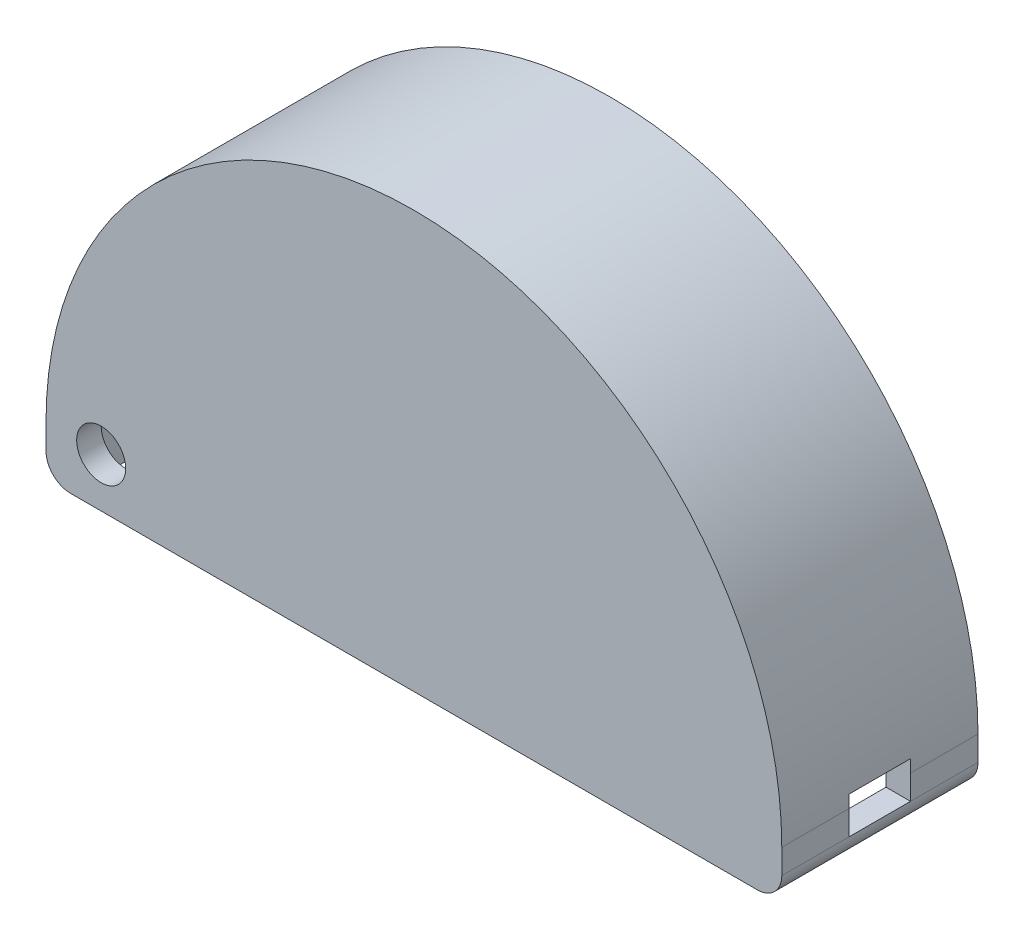
ISO-10303-21;
HEADER;
FILE_DESCRIPTION(('STEP AP214'),'2;1');
FILE_NAME('part.step','',(''),(''),'','','');
FILE_SCHEMA(('AUTOMOTIVE_DESIGN { 1 0 10303 214 1 1 1 1 }'));
ENDSEC;
DATA;
#1=APPLICATION_CONTEXT('core data for automotive mechanical design processes');
#2=APPLICATION_PROTOCOL_DEFINITION('international standard','automotive_design',2000,#1);
#3=PRODUCT_CONTEXT('',#1,'mechanical');
#4=PRODUCT('Part','Part','',(#3));
#5=PRODUCT_RELATED_PRODUCT_CATEGORY('part','',(#4));
#6=PRODUCT_DEFINITION_FORMATION('','',#4);
#7=PRODUCT_DEFINITION_CONTEXT('part definition',#1,'design');
#8=PRODUCT_DEFINITION('design','',#6,#7);
#9=PRODUCT_DEFINITION_SHAPE('','',#8);
#10=(LENGTH_UNIT() NAMED_UNIT(*) SI_UNIT(.MILLI.,.METRE.));
#11=(NAMED_UNIT(*) PLANE_ANGLE_UNIT() SI_UNIT($,.RADIAN.));
#12=(NAMED_UNIT(*) SI_UNIT($,.STERADIAN.) SOLID_ANGLE_UNIT());
#13=UNCERTAINTY_MEASURE_WITH_UNIT(LENGTH_MEASURE(1.E-05),#10,'distance_accuracy_value','');
#14=(GEOMETRIC_REPRESENTATION_CONTEXT(3) GLOBAL_UNCERTAINTY_ASSIGNED_CONTEXT((#13)) GLOBAL_UNIT_ASSIGNED_CONTEXT((#10,
#11,#12)) REPRESENTATION_CONTEXT('',''));
#15=CARTESIAN_POINT('',(0.,0.,0.));
#16=DIRECTION('',(0.,0.,1.));
#17=DIRECTION('',(1.,0.,0.));
#18=AXIS2_PLACEMENT_3D('',#15,#16,#17);
#19=CARTESIAN_POINT('',(27.75,-2.,-4.));
#20=DIRECTION('',(1.,0.,0.));
#21=DIRECTION('',(0.,1.,0.));
#22=AXIS2_PLACEMENT_3D('',#19,#20,#21);
#23=PLANE('',#22);
#24=DIRECTION('',(0.,1.,0.));
#25=VECTOR('',#24,1.);
#26=CARTESIAN_POINT('',(27.75,-2.,4.));
#27=LINE('',#26,#25);
#28=CARTESIAN_POINT('',(27.75,-0.999999999999998,4.));
#29=VERTEX_POINT('',#28);
#30=CARTESIAN_POINT('',(27.75,0.,4.));
#31=VERTEX_POINT('',#30);
#32=EDGE_CURVE('E242',#29,#31,#27,.T.);
#33=ORIENTED_EDGE('',*,*,#32,.F.);
#34=DIRECTION('',(0.,0.,1.));
#35=VECTOR('',#34,1.);
#36=CARTESIAN_POINT('',(27.75,-0.999999999999998,-4.));
#37=LINE('',#36,#35);
#38=CARTESIAN_POINT('',(27.75,-1.,1.25));
#39=VERTEX_POINT('',#38);
#40=EDGE_CURVE('E283',#29,#39,#37,.F.);
#41=ORIENTED_EDGE('',*,*,#40,.T.);
#42=DIRECTION('',(0.,-1.,0.));
#43=VECTOR('',#42,1.);
#44=CARTESIAN_POINT('',(27.75,-1.,1.25));
#45=LINE('',#44,#43);
#46=CARTESIAN_POINT('',(27.75,0.,1.25));
#47=VERTEX_POINT('',#46);
#48=EDGE_CURVE('E174',#47,#39,#45,.T.);
#49=ORIENTED_EDGE('',*,*,#48,.F.);
#50=DIRECTION('',(0.,0.,1.));
#51=VECTOR('',#50,1.);
#52=CARTESIAN_POINT('',(27.75,0.,-4.));
#53=LINE('',#52,#51);
#54=EDGE_CURVE('E258',#47,#31,#53,.T.);
#55=ORIENTED_EDGE('',*,*,#54,.T.);
#56=EDGE_LOOP('',(#33,#41,#49,#55));
#57=FACE_BOUND('',#56,.T.);
#58=ADVANCED_FACE('F39',(#57),#23,.T.);
#59=CARTESIAN_POINT('',(-2.25,-2.,-4.));
#60=DIRECTION('',(0.,-1.,0.));
#61=DIRECTION('',(0.,0.,-1.));
#62=AXIS2_PLACEMENT_3D('',#59,#60,#61);
#63=PLANE('',#62);
#64=DIRECTION('',(1.,0.,0.));
#65=VECTOR('',#64,1.);
#66=CARTESIAN_POINT('',(-2.25,-2.,-4.));
#67=LINE('',#66,#65);
#68=CARTESIAN_POINT('',(-1.25,-2.,-4.));
#69=VERTEX_POINT('',#68);
#70=CARTESIAN_POINT('',(26.75,-2.,-4.));
#71=VERTEX_POINT('',#70);
#72=EDGE_CURVE('E249',#69,#71,#67,.T.);
#73=ORIENTED_EDGE('',*,*,#72,.T.);
#74=DIRECTION('',(0.,0.,1.));
#75=VECTOR('',#74,1.);
#76=CARTESIAN_POINT('',(26.75,-2.,-4.));
#77=LINE('',#76,#75);
#78=CARTESIAN_POINT('',(26.75,-2.,-3.));
#79=VERTEX_POINT('',#78);
#80=EDGE_CURVE('E275',#71,#79,#77,.T.);
#81=ORIENTED_EDGE('',*,*,#80,.T.);
#82=DIRECTION('',(1.,0.,0.));
#83=VECTOR('',#82,1.);
#84=CARTESIAN_POINT('',(-2.25,-2.,-3.));
#85=LINE('',#84,#83);
#86=CARTESIAN_POINT('',(-1.25,-2.,-3.));
#87=VERTEX_POINT('',#86);
#88=EDGE_CURVE('E222',#87,#79,#85,.T.);
#89=ORIENTED_EDGE('',*,*,#88,.F.);
#90=DIRECTION('',(0.,0.,1.));
#91=VECTOR('',#90,1.);
#92=CARTESIAN_POINT('',(-1.25,-2.,-4.));
#93=LINE('',#92,#91);
#94=EDGE_CURVE('E269',#87,#69,#93,.F.);
#95=ORIENTED_EDGE('',*,*,#94,.T.);
#96=EDGE_LOOP('',(#73,#81,#89,#95));
#97=FACE_BOUND('',#96,.T.);
#98=ADVANCED_FACE('F291',(#97),#63,.T.);
#99=CARTESIAN_POINT('',(12.75,0.,-4.));
#100=DIRECTION('',(0.,0.,1.));
#101=DIRECTION('',(1.,0.,0.));
#102=AXIS2_PLACEMENT_3D('',#99,#100,#101);
#103=CYLINDRICAL_SURFACE('',#102,15.);
#104=CARTESIAN_POINT('',(12.75,0.,-1.25));
#105=DIRECTION('',(0.,0.,-1.));
#106=DIRECTION('',(-1.,0.,0.));
#107=AXIS2_PLACEMENT_3D('',#104,#105,#106);
#108=CIRCLE('',#107,15.);
#109=CARTESIAN_POINT('',(27.75,0.,-1.25));
#110=VERTEX_POINT('',#109);
#111=CARTESIAN_POINT('',(27.7416643505649,0.5,-1.25));
#112=VERTEX_POINT('',#111);
#113=EDGE_CURVE('E187',#110,#112,#108,.F.);
#114=ORIENTED_EDGE('',*,*,#113,.F.);
#115=CARTESIAN_POINT('',(27.75,0.,-4.));
#116=VERTEX_POINT('',#115);
#117=EDGE_CURVE('E255',#116,#110,#53,.T.);
#118=ORIENTED_EDGE('',*,*,#117,.F.);
#119=CARTESIAN_POINT('',(12.75,0.,-4.));
#120=DIRECTION('',(0.,0.,1.));
#121=DIRECTION('',(-1.,0.,0.));
#122=AXIS2_PLACEMENT_3D('',#119,#120,#121);
#123=CIRCLE('',#122,15.);
#124=CARTESIAN_POINT('',(-2.25,0.,-4.));
#125=VERTEX_POINT('',#124);
#126=EDGE_CURVE('E244',#116,#125,#123,.T.);
#127=ORIENTED_EDGE('',*,*,#126,.T.);
#128=DIRECTION('',(0.,0.,1.));
#129=VECTOR('',#128,1.);
#130=CARTESIAN_POINT('',(-2.25,0.,-4.));
#131=LINE('',#130,#129);
#132=CARTESIAN_POINT('',(-2.25,0.,4.));
#133=VERTEX_POINT('',#132);
#134=EDGE_CURVE('E254',#125,#133,#131,.T.);
#135=ORIENTED_EDGE('',*,*,#134,.T.);
#136=CARTESIAN_POINT('',(12.75,0.,4.));
#137=DIRECTION('',(0.,0.,1.));
#138=DIRECTION('',(-1.,0.,0.));
#139=AXIS2_PLACEMENT_3D('',#136,#137,#138);
#140=CIRCLE('',#139,15.);
#141=EDGE_CURVE('E210',#31,#133,#140,.T.);
#142=ORIENTED_EDGE('',*,*,#141,.F.);
#143=ORIENTED_EDGE('',*,*,#54,.F.);
#144=CARTESIAN_POINT('',(12.75,0.,1.25));
#145=DIRECTION('',(0.,0.,1.));
#146=DIRECTION('',(1.,0.,0.));
#147=AXIS2_PLACEMENT_3D('',#144,#145,#146);
#148=CIRCLE('',#147,15.);
#149=CARTESIAN_POINT('',(27.7416643505649,0.5,1.25));
#150=VERTEX_POINT('',#149);
#151=EDGE_CURVE('E182',#150,#47,#148,.F.);
#152=ORIENTED_EDGE('',*,*,#151,.F.);
#153=DIRECTION('',(0.,0.,1.));
#154=VECTOR('',#153,1.);
#155=CARTESIAN_POINT('',(27.7416643505649,0.5,-4.));
#156=LINE('',#155,#154);
#157=EDGE_CURVE('E173',#112,#150,#156,.T.);
#158=ORIENTED_EDGE('',*,*,#157,.F.);
#159=EDGE_LOOP('',(#114,#118,#127,#135,#142,#143,#152,#158));
#160=FACE_BOUND('',#159,.T.);
#161=ADVANCED_FACE('F337',(#160),#103,.T.);
#162=DIRECTION('',(0.,1.,0.));
#163=VECTOR('',#162,1.);
#164=CARTESIAN_POINT('',(27.75,-1.,-1.25));
#165=LINE('',#164,#163);
#166=CARTESIAN_POINT('',(27.75,-1.,-1.25));
#167=VERTEX_POINT('',#166);
#168=EDGE_CURVE('E166',#167,#110,#165,.T.);
#169=ORIENTED_EDGE('',*,*,#168,.F.);
#170=DIRECTION('',(0.,0.,1.));
#171=VECTOR('',#170,1.);
#172=CARTESIAN_POINT('',(27.75,-0.999999999999998,-4.));
#173=LINE('',#172,#171);
#174=CARTESIAN_POINT('',(27.75,-0.999999999999998,-4.));
#175=VERTEX_POINT('',#174);
#176=EDGE_CURVE('E62',#167,#175,#173,.F.);
#177=ORIENTED_EDGE('',*,*,#176,.T.);
#178=DIRECTION('',(0.,1.,0.));
#179=VECTOR('',#178,1.);
#180=CARTESIAN_POINT('',(27.75,-2.,-4.));
#181=LINE('',#180,#179);
#182=EDGE_CURVE('E252',#175,#116,#181,.T.);
#183=ORIENTED_EDGE('',*,*,#182,.T.);
#184=ORIENTED_EDGE('',*,*,#117,.T.);
#185=EDGE_LOOP('',(#169,#177,#183,#184));
#186=FACE_BOUND('',#185,.T.);
#187=ADVANCED_FACE('F338',(#186),#23,.T.);
#188=DIRECTION('',(1.,0.,0.));
#189=VECTOR('',#188,1.);
#190=CARTESIAN_POINT('',(-2.25,-2.,3.));
#191=LINE('',#190,#189);
#192=CARTESIAN_POINT('',(-1.25,-2.,3.));
#193=VERTEX_POINT('',#192);
#194=CARTESIAN_POINT('',(26.75,-2.,3.));
#195=VERTEX_POINT('',#194);
#196=EDGE_CURVE('E219',#193,#195,#191,.T.);
#197=ORIENTED_EDGE('',*,*,#196,.T.);
#198=DIRECTION('',(0.,0.,1.));
#199=VECTOR('',#198,1.);
#200=CARTESIAN_POINT('',(26.75,-2.,-4.));
#201=LINE('',#200,#199);
#202=CARTESIAN_POINT('',(26.75,-2.,4.));
#203=VERTEX_POINT('',#202);
#204=EDGE_CURVE('E273',#195,#203,#201,.T.);
#205=ORIENTED_EDGE('',*,*,#204,.T.);
#206=DIRECTION('',(1.,0.,0.));
#207=VECTOR('',#206,1.);
#208=CARTESIAN_POINT('',(-2.25,-2.,4.));
#209=LINE('',#208,#207);
#210=CARTESIAN_POINT('',(-1.25,-2.,4.));
#211=VERTEX_POINT('',#210);
#212=EDGE_CURVE('E239',#211,#203,#209,.T.);
#213=ORIENTED_EDGE('',*,*,#212,.F.);
#214=DIRECTION('',(0.,0.,1.));
#215=VECTOR('',#214,1.);
#216=CARTESIAN_POINT('',(-1.25,-2.,-4.));
#217=LINE('',#216,#215);
#218=EDGE_CURVE('E271',#211,#193,#217,.F.);
#219=ORIENTED_EDGE('',*,*,#218,.T.);
#220=EDGE_LOOP('',(#197,#205,#213,#219));
#221=FACE_BOUND('',#220,.T.);
#222=ADVANCED_FACE('F308',(#221),#63,.T.);
#223=CARTESIAN_POINT('',(-2.25,-2.,-4.));
#224=DIRECTION('',(-1.,0.,0.));
#225=DIRECTION('',(0.,0.,1.));
#226=AXIS2_PLACEMENT_3D('',#223,#224,#225);
#227=PLANE('',#226);
#228=DIRECTION('',(0.,-1.,0.));
#229=VECTOR('',#228,1.);
#230=CARTESIAN_POINT('',(-2.25,-2.,-4.));
#231=LINE('',#230,#229);
#232=CARTESIAN_POINT('',(-2.25,-1.,-4.));
#233=VERTEX_POINT('',#232);
#234=EDGE_CURVE('E247',#125,#233,#231,.T.);
#235=ORIENTED_EDGE('',*,*,#234,.T.);
#236=DIRECTION('',(0.,0.,1.));
#237=VECTOR('',#236,1.);
#238=CARTESIAN_POINT('',(-2.25,-1.,-4.));
#239=LINE('',#238,#237);
#240=CARTESIAN_POINT('',(-2.25,-1.,4.));
#241=VERTEX_POINT('',#240);
#242=EDGE_CURVE('E11',#233,#241,#239,.T.);
#243=ORIENTED_EDGE('',*,*,#242,.T.);
#244=DIRECTION('',(0.,-1.,0.));
#245=VECTOR('',#244,1.);
#246=CARTESIAN_POINT('',(-2.25,-2.,4.));
#247=LINE('',#246,#245);
#248=EDGE_CURVE('E236',#133,#241,#247,.T.);
#249=ORIENTED_EDGE('',*,*,#248,.F.);
#250=ORIENTED_EDGE('',*,*,#134,.F.);
#251=EDGE_LOOP('',(#235,#243,#249,#250));
#252=FACE_BOUND('',#251,.T.);
#253=ADVANCED_FACE('F345',(#252),#227,.T.);
#254=CARTESIAN_POINT('',(12.75,0.,-4.));
#255=DIRECTION('',(0.,0.,-1.));
#256=DIRECTION('',(-1.,0.,0.));
#257=AXIS2_PLACEMENT_3D('',#254,#255,#256);
#258=PLANE('',#257);
#259=CARTESIAN_POINT('',(0.,0.,-4.));
#260=DIRECTION('',(0.,0.,1.));
#261=DIRECTION('',(1.,0.,0.));
#262=AXIS2_PLACEMENT_3D('',#259,#260,#261);
#263=CIRCLE('',#262,1.);
#264=CARTESIAN_POINT('',(1.,0.,-4.));
#265=VERTEX_POINT('',#264);
#266=EDGE_CURVE('E190',#265,#265,#263,.T.);
#267=ORIENTED_EDGE('',*,*,#266,.T.);
#268=EDGE_LOOP('',(#267));
#269=FACE_BOUND('',#268,.T.);
#270=ORIENTED_EDGE('',*,*,#182,.F.);
#271=CARTESIAN_POINT('',(26.75,-1.,-4.));
#272=DIRECTION('',(0.,0.,-1.));
#273=DIRECTION('',(-1.,0.,0.));
#274=AXIS2_PLACEMENT_3D('',#271,#272,#273);
#275=CIRCLE('',#274,1.);
#276=EDGE_CURVE('E47',#175,#71,#275,.T.);
#277=ORIENTED_EDGE('',*,*,#276,.T.);
#278=ORIENTED_EDGE('',*,*,#72,.F.);
#279=CARTESIAN_POINT('',(-1.25,-1.,-4.));
#280=DIRECTION('',(0.,0.,-1.));
#281=DIRECTION('',(-1.,0.,0.));
#282=AXIS2_PLACEMENT_3D('',#279,#280,#281);
#283=CIRCLE('',#282,1.);
#284=EDGE_CURVE('E54',#69,#233,#283,.T.);
#285=ORIENTED_EDGE('',*,*,#284,.T.);
#286=ORIENTED_EDGE('',*,*,#234,.F.);
#287=ORIENTED_EDGE('',*,*,#126,.F.);
#288=EDGE_LOOP('',(#270,#277,#278,#285,#286,#287));
#289=FACE_BOUND('',#288,.T.);
#290=ADVANCED_FACE('F286',(#269,#289),#258,.T.);
#291=CARTESIAN_POINT('',(12.75,0.,4.));
#292=DIRECTION('',(0.,0.,-1.));
#293=DIRECTION('',(-1.,0.,0.));
#294=AXIS2_PLACEMENT_3D('',#291,#292,#293);
#295=PLANE('',#294);
#296=CARTESIAN_POINT('',(0.,0.,4.));
#297=DIRECTION('',(0.,0.,-1.));
#298=DIRECTION('',(-1.,0.,0.));
#299=AXIS2_PLACEMENT_3D('',#296,#297,#298);
#300=CIRCLE('',#299,1.);
#301=CARTESIAN_POINT('',(-1.,0.,4.));
#302=VERTEX_POINT('',#301);
#303=EDGE_CURVE('E197',#302,#302,#300,.T.);
#304=ORIENTED_EDGE('',*,*,#303,.T.);
#305=EDGE_LOOP('',(#304));
#306=FACE_BOUND('',#305,.T.);
#307=ORIENTED_EDGE('',*,*,#212,.T.);
#308=CARTESIAN_POINT('',(26.75,-1.,4.));
#309=DIRECTION('',(0.,0.,-1.));
#310=DIRECTION('',(-1.,0.,0.));
#311=AXIS2_PLACEMENT_3D('',#308,#309,#310);
#312=CIRCLE('',#311,1.);
#313=EDGE_CURVE('E280',#203,#29,#312,.F.);
#314=ORIENTED_EDGE('',*,*,#313,.T.);
#315=ORIENTED_EDGE('',*,*,#32,.T.);
#316=ORIENTED_EDGE('',*,*,#141,.T.);
#317=ORIENTED_EDGE('',*,*,#248,.T.);
#318=CARTESIAN_POINT('',(-1.25,-1.,4.));
#319=DIRECTION('',(0.,0.,-1.));
#320=DIRECTION('',(-1.,0.,0.));
#321=AXIS2_PLACEMENT_3D('',#318,#319,#320);
#322=CIRCLE('',#321,1.);
#323=EDGE_CURVE('E278',#241,#211,#322,.F.);
#324=ORIENTED_EDGE('',*,*,#323,.T.);
#325=EDGE_LOOP('',(#307,#314,#315,#316,#317,#324));
#326=FACE_BOUND('',#325,.T.);
#327=ADVANCED_FACE('F361',(#306,#326),#295,.F.);
#328=CARTESIAN_POINT('',(12.75,0.,-4.));
#329=DIRECTION('',(0.,0.,1.));
#330=DIRECTION('',(1.,0.,0.));
#331=AXIS2_PLACEMENT_3D('',#328,#329,#330);
#332=CYLINDRICAL_SURFACE('',#331,14.);
#333=DIRECTION('',(0.,0.,1.));
#334=VECTOR('',#333,1.);
#335=CARTESIAN_POINT('',(26.75,0.,-4.));
#336=LINE('',#335,#334);
#337=CARTESIAN_POINT('',(26.75,0.,-3.));
#338=VERTEX_POINT('',#337);
#339=CARTESIAN_POINT('',(26.75,0.,-1.25));
#340=VERTEX_POINT('',#339);
#341=EDGE_CURVE('E208',#338,#340,#336,.T.);
#342=ORIENTED_EDGE('',*,*,#341,.T.);
#343=CARTESIAN_POINT('',(12.75,0.,-1.25));
#344=DIRECTION('',(0.,0.,-1.));
#345=DIRECTION('',(-1.,0.,0.));
#346=AXIS2_PLACEMENT_3D('',#343,#344,#345);
#347=CIRCLE('',#346,14.);
#348=CARTESIAN_POINT('',(26.7410685796332,0.499999999999998,-1.25));
#349=VERTEX_POINT('',#348);
#350=EDGE_CURVE('E180',#349,#340,#347,.T.);
#351=ORIENTED_EDGE('',*,*,#350,.F.);
#352=DIRECTION('',(0.,0.,1.));
#353=VECTOR('',#352,1.);
#354=CARTESIAN_POINT('',(26.7410685796332,0.499999999999998,-4.));
#355=LINE('',#354,#353);
#356=CARTESIAN_POINT('',(26.7410685796332,0.499999999999998,1.25));
#357=VERTEX_POINT('',#356);
#358=EDGE_CURVE('E165',#357,#349,#355,.F.);
#359=ORIENTED_EDGE('',*,*,#358,.F.);
#360=CARTESIAN_POINT('',(12.75,0.,1.25));
#361=DIRECTION('',(0.,0.,1.));
#362=DIRECTION('',(1.,0.,0.));
#363=AXIS2_PLACEMENT_3D('',#360,#361,#362);
#364=CIRCLE('',#363,14.);
#365=CARTESIAN_POINT('',(26.75,0.,1.25));
#366=VERTEX_POINT('',#365);
#367=EDGE_CURVE('E155',#366,#357,#364,.T.);
#368=ORIENTED_EDGE('',*,*,#367,.F.);
#369=CARTESIAN_POINT('',(26.75,0.,3.));
#370=VERTEX_POINT('',#369);
#371=EDGE_CURVE('E211',#366,#370,#336,.T.);
#372=ORIENTED_EDGE('',*,*,#371,.T.);
#373=CARTESIAN_POINT('',(12.75,0.,3.));
#374=DIRECTION('',(0.,0.,-1.));
#375=DIRECTION('',(-1.,0.,0.));
#376=AXIS2_PLACEMENT_3D('',#373,#374,#375);
#377=CIRCLE('',#376,14.);
#378=CARTESIAN_POINT('',(-1.25,0.,3.));
#379=VERTEX_POINT('',#378);
#380=EDGE_CURVE('E200',#370,#379,#377,.F.);
#381=ORIENTED_EDGE('',*,*,#380,.T.);
#382=DIRECTION('',(0.,0.,1.));
#383=VECTOR('',#382,1.);
#384=CARTESIAN_POINT('',(-1.25,0.,-4.));
#385=LINE('',#384,#383);
#386=CARTESIAN_POINT('',(-1.25,0.,-3.));
#387=VERTEX_POINT('',#386);
#388=EDGE_CURVE('E201',#387,#379,#385,.T.);
#389=ORIENTED_EDGE('',*,*,#388,.F.);
#390=CARTESIAN_POINT('',(12.75,0.,-3.));
#391=DIRECTION('',(0.,0.,-1.));
#392=DIRECTION('',(-1.,0.,0.));
#393=AXIS2_PLACEMENT_3D('',#390,#391,#392);
#394=CIRCLE('',#393,14.);
#395=EDGE_CURVE('E212',#338,#387,#394,.F.);
#396=ORIENTED_EDGE('',*,*,#395,.F.);
#397=EDGE_LOOP('',(#342,#351,#359,#368,#372,#381,#389,#396));
#398=FACE_BOUND('',#397,.T.);
#399=ADVANCED_FACE('F179',(#398),#332,.F.);
#400=CARTESIAN_POINT('',(26.75,-2.,-4.));
#401=DIRECTION('',(1.,0.,0.));
#402=DIRECTION('',(0.,1.,0.));
#403=AXIS2_PLACEMENT_3D('',#400,#401,#402);
#404=PLANE('',#403);
#405=DIRECTION('',(0.,0.,-1.));
#406=VECTOR('',#405,1.);
#407=CARTESIAN_POINT('',(26.75,-1.,-4.));
#408=LINE('',#407,#406);
#409=CARTESIAN_POINT('',(26.75,-1.,1.25));
#410=VERTEX_POINT('',#409);
#411=CARTESIAN_POINT('',(26.75,-1.,-1.25));
#412=VERTEX_POINT('',#411);
#413=EDGE_CURVE('E263',#410,#412,#408,.T.);
#414=ORIENTED_EDGE('',*,*,#413,.T.);
#415=DIRECTION('',(0.,1.,0.));
#416=VECTOR('',#415,1.);
#417=CARTESIAN_POINT('',(26.75,-2.,-1.25));
#418=LINE('',#417,#416);
#419=EDGE_CURVE('E266',#412,#340,#418,.T.);
#420=ORIENTED_EDGE('',*,*,#419,.T.);
#421=ORIENTED_EDGE('',*,*,#341,.F.);
#422=DIRECTION('',(0.,1.,0.));
#423=VECTOR('',#422,1.);
#424=CARTESIAN_POINT('',(26.75,-2.,-3.));
#425=LINE('',#424,#423);
#426=EDGE_CURVE('E204',#79,#338,#425,.T.);
#427=ORIENTED_EDGE('',*,*,#426,.F.);
#428=DIRECTION('',(0.,0.,1.));
#429=VECTOR('',#428,1.);
#430=CARTESIAN_POINT('',(26.75,-2.,-4.));
#431=LINE('',#430,#429);
#432=EDGE_CURVE('E226',#79,#195,#431,.T.);
#433=ORIENTED_EDGE('',*,*,#432,.T.);
#434=DIRECTION('',(0.,1.,0.));
#435=VECTOR('',#434,1.);
#436=CARTESIAN_POINT('',(26.75,-2.,3.));
#437=LINE('',#436,#435);
#438=EDGE_CURVE('E216',#195,#370,#437,.T.);
#439=ORIENTED_EDGE('',*,*,#438,.T.);
#440=ORIENTED_EDGE('',*,*,#371,.F.);
#441=DIRECTION('',(0.,-1.,0.));
#442=VECTOR('',#441,1.);
#443=CARTESIAN_POINT('',(26.75,-2.,1.25));
#444=LINE('',#443,#442);
#445=EDGE_CURVE('E161',#366,#410,#444,.T.);
#446=ORIENTED_EDGE('',*,*,#445,.T.);
#447=EDGE_LOOP('',(#414,#420,#421,#427,#433,#439,#440,#446));
#448=FACE_BOUND('',#447,.T.);
#449=ADVANCED_FACE('F301',(#448),#404,.F.);
#450=CARTESIAN_POINT('',(-1.25,-2.,-4.));
#451=DIRECTION('',(-1.,0.,0.));
#452=DIRECTION('',(0.,0.,1.));
#453=AXIS2_PLACEMENT_3D('',#450,#451,#452);
#454=PLANE('',#453);
#455=DIRECTION('',(0.,0.,1.));
#456=VECTOR('',#455,1.);
#457=CARTESIAN_POINT('',(-1.25,-2.,-4.));
#458=LINE('',#457,#456);
#459=EDGE_CURVE('E203',#87,#193,#458,.T.);
#460=ORIENTED_EDGE('',*,*,#459,.F.);
#461=DIRECTION('',(0.,-1.,0.));
#462=VECTOR('',#461,1.);
#463=CARTESIAN_POINT('',(-1.25,-2.,-3.));
#464=LINE('',#463,#462);
#465=EDGE_CURVE('E215',#387,#87,#464,.T.);
#466=ORIENTED_EDGE('',*,*,#465,.F.);
#467=ORIENTED_EDGE('',*,*,#388,.T.);
#468=DIRECTION('',(0.,-1.,0.));
#469=VECTOR('',#468,1.);
#470=CARTESIAN_POINT('',(-1.25,-2.,3.));
#471=LINE('',#470,#469);
#472=EDGE_CURVE('E207',#379,#193,#471,.T.);
#473=ORIENTED_EDGE('',*,*,#472,.T.);
#474=EDGE_LOOP('',(#460,#466,#467,#473));
#475=FACE_BOUND('',#474,.T.);
#476=ADVANCED_FACE('F314',(#475),#454,.F.);
#477=CARTESIAN_POINT('',(12.75,0.,-3.));
#478=DIRECTION('',(0.,0.,-1.));
#479=DIRECTION('',(-1.,0.,0.));
#480=AXIS2_PLACEMENT_3D('',#477,#478,#479);
#481=PLANE('',#480);
#482=CARTESIAN_POINT('',(0.,0.,-3.));
#483=DIRECTION('',(0.,0.,-1.));
#484=DIRECTION('',(-1.,0.,0.));
#485=AXIS2_PLACEMENT_3D('',#482,#483,#484);
#486=CIRCLE('',#485,1.);
#487=CARTESIAN_POINT('',(-1.,0.,-3.));
#488=VERTEX_POINT('',#487);
#489=EDGE_CURVE('E194',#488,#488,#486,.T.);
#490=ORIENTED_EDGE('',*,*,#489,.T.);
#491=EDGE_LOOP('',(#490));
#492=FACE_BOUND('',#491,.T.);
#493=ORIENTED_EDGE('',*,*,#395,.T.);
#494=ORIENTED_EDGE('',*,*,#465,.T.);
#495=ORIENTED_EDGE('',*,*,#88,.T.);
#496=ORIENTED_EDGE('',*,*,#426,.T.);
#497=EDGE_LOOP('',(#493,#494,#495,#496));
#498=FACE_BOUND('',#497,.T.);
#499=ADVANCED_FACE('F397',(#492,#498),#481,.F.);
#500=CARTESIAN_POINT('',(12.75,0.,3.));
#501=DIRECTION('',(0.,0.,-1.));
#502=DIRECTION('',(-1.,0.,0.));
#503=AXIS2_PLACEMENT_3D('',#500,#501,#502);
#504=PLANE('',#503);
#505=CARTESIAN_POINT('',(0.,0.,3.));
#506=DIRECTION('',(0.,0.,-1.));
#507=DIRECTION('',(-1.,0.,0.));
#508=AXIS2_PLACEMENT_3D('',#505,#506,#507);
#509=CIRCLE('',#508,1.);
#510=CARTESIAN_POINT('',(-1.,0.,3.));
#511=VERTEX_POINT('',#510);
#512=EDGE_CURVE('E193',#511,#511,#509,.T.);
#513=ORIENTED_EDGE('',*,*,#512,.F.);
#514=EDGE_LOOP('',(#513));
#515=FACE_BOUND('',#514,.T.);
#516=ORIENTED_EDGE('',*,*,#380,.F.);
#517=ORIENTED_EDGE('',*,*,#438,.F.);
#518=ORIENTED_EDGE('',*,*,#196,.F.);
#519=ORIENTED_EDGE('',*,*,#472,.F.);
#520=EDGE_LOOP('',(#516,#517,#518,#519));
#521=FACE_BOUND('',#520,.T.);
#522=ADVANCED_FACE('F305',(#515,#521),#504,.T.);
#523=CARTESIAN_POINT('',(0.,0.,-4.));
#524=DIRECTION('',(0.,0.,1.));
#525=DIRECTION('',(1.,0.,0.));
#526=AXIS2_PLACEMENT_3D('',#523,#524,#525);
#527=CYLINDRICAL_SURFACE('',#526,1.);
#528=ORIENTED_EDGE('',*,*,#512,.T.);
#529=EDGE_LOOP('',(#528));
#530=FACE_BOUND('',#529,.T.);
#531=ORIENTED_EDGE('',*,*,#303,.F.);
#532=EDGE_LOOP('',(#531));
#533=FACE_BOUND('',#532,.T.);
#534=ADVANCED_FACE('F387',(#530,#533),#527,.F.);
#535=ORIENTED_EDGE('',*,*,#266,.F.);
#536=EDGE_LOOP('',(#535));
#537=FACE_BOUND('',#536,.T.);
#538=ORIENTED_EDGE('',*,*,#489,.F.);
#539=EDGE_LOOP('',(#538));
#540=FACE_BOUND('',#539,.T.);
#541=ADVANCED_FACE('F384',(#537,#540),#527,.F.);
#542=CARTESIAN_POINT('',(-2.251,-1.00000000000005,-1.25));
#543=DIRECTION('',(0.,0.,-1.));
#544=DIRECTION('',(-1.,0.,0.));
#545=AXIS2_PLACEMENT_3D('',#542,#543,#544);
#546=PLANE('',#545);
#547=ORIENTED_EDGE('',*,*,#113,.T.);
#548=DIRECTION('',(1.,0.,0.));
#549=VECTOR('',#548,1.);
#550=CARTESIAN_POINT('',(-2.25100000000001,0.499999999999948,-1.25));
#551=LINE('',#550,#549);
#552=EDGE_CURVE('E326',#349,#112,#551,.T.);
#553=ORIENTED_EDGE('',*,*,#552,.F.);
#554=ORIENTED_EDGE('',*,*,#350,.T.);
#555=ORIENTED_EDGE('',*,*,#419,.F.);
#556=DIRECTION('',(1.,0.,0.));
#557=VECTOR('',#556,1.);
#558=CARTESIAN_POINT('',(-2.251,-1.00000000000005,-1.25));
#559=LINE('',#558,#557);
#560=EDGE_CURVE('E323',#412,#167,#559,.T.);
#561=ORIENTED_EDGE('',*,*,#560,.T.);
#562=ORIENTED_EDGE('',*,*,#168,.T.);
#563=EDGE_LOOP('',(#547,#553,#554,#555,#561,#562));
#564=FACE_BOUND('',#563,.T.);
#565=ADVANCED_FACE('F334',(#564),#546,.F.);
#566=CARTESIAN_POINT('',(-2.251,-1.00000000000005,1.25));
#567=DIRECTION('',(0.,-1.,0.));
#568=DIRECTION('',(1.,0.,0.));
#569=AXIS2_PLACEMENT_3D('',#566,#567,#568);
#570=PLANE('',#569);
#571=DIRECTION('',(1.,0.,0.));
#572=VECTOR('',#571,1.);
#573=CARTESIAN_POINT('',(-2.251,-1.00000000000005,1.25));
#574=LINE('',#573,#572);
#575=EDGE_CURVE('E175',#410,#39,#574,.T.);
#576=ORIENTED_EDGE('',*,*,#575,.T.);
#577=DIRECTION('',(0.,0.,-1.));
#578=VECTOR('',#577,1.);
#579=CARTESIAN_POINT('',(27.75,-1.,1.25));
#580=LINE('',#579,#578);
#581=EDGE_CURVE('E324',#39,#167,#580,.T.);
#582=ORIENTED_EDGE('',*,*,#581,.T.);
#583=ORIENTED_EDGE('',*,*,#560,.F.);
#584=ORIENTED_EDGE('',*,*,#413,.F.);
#585=EDGE_LOOP('',(#576,#582,#583,#584));
#586=FACE_BOUND('',#585,.T.);
#587=ADVANCED_FACE('F321',(#586),#570,.F.);
#588=CARTESIAN_POINT('',(-2.251,-1.00000000000005,1.25));
#589=DIRECTION('',(0.,0.,1.));
#590=DIRECTION('',(1.,0.,0.));
#591=AXIS2_PLACEMENT_3D('',#588,#589,#590);
#592=PLANE('',#591);
#593=ORIENTED_EDGE('',*,*,#151,.T.);
#594=ORIENTED_EDGE('',*,*,#48,.T.);
#595=ORIENTED_EDGE('',*,*,#575,.F.);
#596=ORIENTED_EDGE('',*,*,#445,.F.);
#597=ORIENTED_EDGE('',*,*,#367,.T.);
#598=DIRECTION('',(1.,0.,0.));
#599=VECTOR('',#598,1.);
#600=CARTESIAN_POINT('',(-2.25100000000001,0.499999999999948,1.25));
#601=LINE('',#600,#599);
#602=EDGE_CURVE('E158',#357,#150,#601,.T.);
#603=ORIENTED_EDGE('',*,*,#602,.T.);
#604=EDGE_LOOP('',(#593,#594,#595,#596,#597,#603));
#605=FACE_BOUND('',#604,.T.);
#606=ADVANCED_FACE('F157',(#605),#592,.F.);
#607=CARTESIAN_POINT('',(-2.25100000000001,0.499999999999948,1.25));
#608=DIRECTION('',(0.,1.,0.));
#609=DIRECTION('',(-1.,0.,0.));
#610=AXIS2_PLACEMENT_3D('',#607,#608,#609);
#611=PLANE('',#610);
#612=ORIENTED_EDGE('',*,*,#157,.T.);
#613=ORIENTED_EDGE('',*,*,#602,.F.);
#614=ORIENTED_EDGE('',*,*,#358,.T.);
#615=ORIENTED_EDGE('',*,*,#552,.T.);
#616=EDGE_LOOP('',(#612,#613,#614,#615));
#617=FACE_BOUND('',#616,.T.);
#618=ADVANCED_FACE('F169',(#617),#611,.F.);
#619=CARTESIAN_POINT('',(26.75,-1.,-4.));
#620=DIRECTION('',(0.,0.,1.));
#621=DIRECTION('',(1.,0.,0.));
#622=AXIS2_PLACEMENT_3D('',#619,#620,#621);
#623=CYLINDRICAL_SURFACE('',#622,1.);
#624=ORIENTED_EDGE('',*,*,#581,.F.);
#625=ORIENTED_EDGE('',*,*,#40,.F.);
#626=ORIENTED_EDGE('',*,*,#313,.F.);
#627=ORIENTED_EDGE('',*,*,#204,.F.);
#628=ORIENTED_EDGE('',*,*,#432,.F.);
#629=ORIENTED_EDGE('',*,*,#80,.F.);
#630=ORIENTED_EDGE('',*,*,#276,.F.);
#631=ORIENTED_EDGE('',*,*,#176,.F.);
#632=EDGE_LOOP('',(#624,#625,#626,#627,#628,#629,#630,#631));
#633=FACE_BOUND('',#632,.T.);
#634=ADVANCED_FACE('F295',(#633),#623,.T.);
#635=CARTESIAN_POINT('',(-1.25,-1.,-4.));
#636=DIRECTION('',(0.,0.,1.));
#637=DIRECTION('',(1.,0.,0.));
#638=AXIS2_PLACEMENT_3D('',#635,#636,#637);
#639=CYLINDRICAL_SURFACE('',#638,1.);
#640=ORIENTED_EDGE('',*,*,#459,.T.);
#641=ORIENTED_EDGE('',*,*,#218,.F.);
#642=ORIENTED_EDGE('',*,*,#323,.F.);
#643=ORIENTED_EDGE('',*,*,#242,.F.);
#644=ORIENTED_EDGE('',*,*,#284,.F.);
#645=ORIENTED_EDGE('',*,*,#94,.F.);
#646=EDGE_LOOP('',(#640,#641,#642,#643,#644,#645));
#647=FACE_BOUND('',#646,.T.);
#648=ADVANCED_FACE('F41',(#647),#639,.T.);
#649=CLOSED_SHELL('',(#58,#98,#161,#187,#222,#253,#290,#327,#399,#449,#476,#499,#522,#534,#541,
#565,#587,#606,#618,#634,#648));
#650=MANIFOLD_SOLID_BREP('B2',#649);
#651=ADVANCED_BREP_SHAPE_REPRESENTATION('',(#18,#650),#14);
#652=SHAPE_DEFINITION_REPRESENTATION(#9,#651);
ENDSEC;
END-ISO-10303-21;
